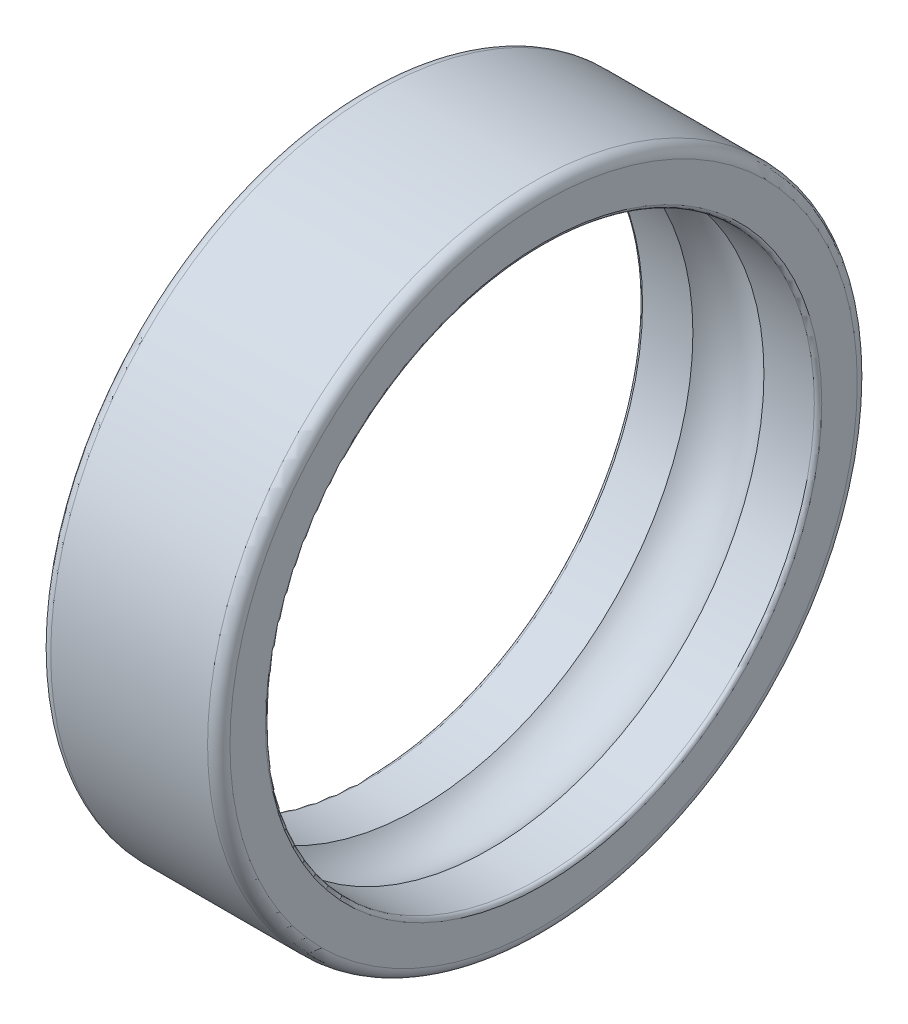
ISO-10303-21;
HEADER;
FILE_DESCRIPTION(('STEP AP214'),'2;1');
FILE_NAME('part.step','',(''),(''),'','','');
FILE_SCHEMA(('AUTOMOTIVE_DESIGN { 1 0 10303 214 1 1 1 1 }'));
ENDSEC;
DATA;
#1=APPLICATION_CONTEXT('core data for automotive mechanical design processes');
#2=APPLICATION_PROTOCOL_DEFINITION('international standard','automotive_design',2000,#1);
#3=PRODUCT_CONTEXT('',#1,'mechanical');
#4=PRODUCT('Part','Part','',(#3));
#5=PRODUCT_RELATED_PRODUCT_CATEGORY('part','',(#4));
#6=PRODUCT_DEFINITION_FORMATION('','',#4);
#7=PRODUCT_DEFINITION_CONTEXT('part definition',#1,'design');
#8=PRODUCT_DEFINITION('design','',#6,#7);
#9=PRODUCT_DEFINITION_SHAPE('','',#8);
#10=(LENGTH_UNIT() NAMED_UNIT(*) SI_UNIT(.MILLI.,.METRE.));
#11=(NAMED_UNIT(*) PLANE_ANGLE_UNIT() SI_UNIT($,.RADIAN.));
#12=(NAMED_UNIT(*) SI_UNIT($,.STERADIAN.) SOLID_ANGLE_UNIT());
#13=UNCERTAINTY_MEASURE_WITH_UNIT(LENGTH_MEASURE(1.E-05),#10,'distance_accuracy_value','');
#14=(GEOMETRIC_REPRESENTATION_CONTEXT(3) GLOBAL_UNCERTAINTY_ASSIGNED_CONTEXT((#13)) GLOBAL_UNIT_ASSIGNED_CONTEXT((#10,
#11,#12)) REPRESENTATION_CONTEXT('',''));
#15=CARTESIAN_POINT('',(0.,0.,0.));
#16=DIRECTION('',(0.,0.,1.));
#17=DIRECTION('',(1.,0.,0.));
#18=AXIS2_PLACEMENT_3D('',#15,#16,#17);
#19=CARTESIAN_POINT('',(0.,-28.520137624798,-28.));
#20=DIRECTION('',(-1.,0.,0.));
#21=DIRECTION('',(0.,0.,1.));
#22=AXIS2_PLACEMENT_3D('',#19,#20,#21);
#23=PLANE('',#22);
#24=CARTESIAN_POINT('',(0.,0.,0.));
#25=DIRECTION('',(-1.,0.,0.));
#26=DIRECTION('',(0.,0.,-1.));
#27=AXIS2_PLACEMENT_3D('',#24,#25,#26);
#28=CIRCLE('',#27,28.0000000447043);
#29=CARTESIAN_POINT('',(0.,0.,-28.0000000447043));
#30=VERTEX_POINT('',#29);
#31=EDGE_CURVE('E50',#30,#30,#28,.F.);
#32=ORIENTED_EDGE('',*,*,#31,.F.);
#33=EDGE_LOOP('',(#32));
#34=FACE_BOUND('',#33,.T.);
#35=CARTESIAN_POINT('',(0.,0.,0.));
#36=DIRECTION('',(1.,0.,0.));
#37=DIRECTION('',(0.,-1.16849134395206E-09,1.));
#38=AXIS2_PLACEMENT_3D('',#35,#36,#37);
#39=CIRCLE('',#38,24.8333333333337);
#40=CARTESIAN_POINT('',(0.,-2.90175350414764E-08,24.8333333333337));
#41=VERTEX_POINT('',#40);
#42=EDGE_CURVE('E47',#41,#41,#39,.T.);
#43=ORIENTED_EDGE('',*,*,#42,.T.);
#44=EDGE_LOOP('',(#43));
#45=FACE_BOUND('',#44,.T.);
#46=ADVANCED_FACE('F15',(#34,#45),#23,.T.);
#47=CARTESIAN_POINT('',(16.,-28.520137624798,28.));
#48=DIRECTION('',(1.,0.,0.));
#49=DIRECTION('',(0.,0.,-1.));
#50=AXIS2_PLACEMENT_3D('',#47,#48,#49);
#51=PLANE('',#50);
#52=CARTESIAN_POINT('',(16.,0.,0.));
#53=DIRECTION('',(1.,0.,0.));
#54=DIRECTION('',(0.,0.,1.));
#55=AXIS2_PLACEMENT_3D('',#52,#53,#54);
#56=CIRCLE('',#55,28.0000000965721);
#57=CARTESIAN_POINT('',(16.,0.,28.0000000965721));
#58=VERTEX_POINT('',#57);
#59=EDGE_CURVE('E44',#58,#58,#56,.T.);
#60=ORIENTED_EDGE('',*,*,#59,.T.);
#61=EDGE_LOOP('',(#60));
#62=FACE_BOUND('',#61,.T.);
#63=CARTESIAN_POINT('',(16.,0.,0.));
#64=DIRECTION('',(-1.,0.,0.));
#65=DIRECTION('',(0.,0.,-1.));
#66=AXIS2_PLACEMENT_3D('',#63,#64,#65);
#67=CIRCLE('',#66,24.8333334037541);
#68=CARTESIAN_POINT('',(16.,0.,-24.8333334037541));
#69=VERTEX_POINT('',#68);
#70=EDGE_CURVE('E41',#69,#69,#67,.F.);
#71=ORIENTED_EDGE('',*,*,#70,.F.);
#72=EDGE_LOOP('',(#71));
#73=FACE_BOUND('',#72,.T.);
#74=ADVANCED_FACE('F59',(#62,#73),#51,.T.);
#75=CARTESIAN_POINT('',(0.999999999999226,0.,0.));
#76=DIRECTION('',(1.,0.,0.));
#77=DIRECTION('',(0.,0.,1.));
#78=AXIS2_PLACEMENT_3D('',#75,#76,#77);
#79=TOROIDAL_SURFACE('',#78,28.0000000000008,0.999999999999227);
#80=ORIENTED_EDGE('',*,*,#31,.T.);
#81=EDGE_LOOP('',(#80));
#82=FACE_BOUND('',#81,.T.);
#83=CARTESIAN_POINT('',(0.999999999999226,0.,0.));
#84=DIRECTION('',(-1.,0.,0.));
#85=DIRECTION('',(0.,0.,-1.));
#86=AXIS2_PLACEMENT_3D('',#83,#84,#85);
#87=CIRCLE('',#86,29.);
#88=CARTESIAN_POINT('',(0.999999999999226,0.,-29.));
#89=VERTEX_POINT('',#88);
#90=EDGE_CURVE('E38',#89,#89,#87,.F.);
#91=ORIENTED_EDGE('',*,*,#90,.F.);
#92=EDGE_LOOP('',(#91));
#93=FACE_BOUND('',#92,.T.);
#94=ADVANCED_FACE('F54',(#82,#93),#79,.T.);
#95=CARTESIAN_POINT('',(0.333333333333645,0.,0.));
#96=DIRECTION('',(1.,0.,0.));
#97=DIRECTION('',(0.,0.,1.));
#98=AXIS2_PLACEMENT_3D('',#95,#96,#97);
#99=TOROIDAL_SURFACE('',#98,24.8333333333337,0.333333333333645);
#100=CARTESIAN_POINT('',(0.333333333333332,0.,0.));
#101=DIRECTION('',(1.,0.,0.));
#102=DIRECTION('',(0.,0.,1.));
#103=AXIS2_PLACEMENT_3D('',#100,#101,#102);
#104=CIRCLE('',#103,24.5);
#105=CARTESIAN_POINT('',(0.333333333333332,0.,24.5));
#106=VERTEX_POINT('',#105);
#107=EDGE_CURVE('E35',#106,#106,#104,.T.);
#108=ORIENTED_EDGE('',*,*,#107,.T.);
#109=EDGE_LOOP('',(#108));
#110=FACE_BOUND('',#109,.T.);
#111=ORIENTED_EDGE('',*,*,#42,.F.);
#112=EDGE_LOOP('',(#111));
#113=FACE_BOUND('',#112,.T.);
#114=ADVANCED_FACE('F63',(#110,#113),#99,.T.);
#115=CARTESIAN_POINT('',(50.,0.,0.));
#116=DIRECTION('',(1.,0.,0.));
#117=DIRECTION('',(0.,0.,1.));
#118=AXIS2_PLACEMENT_3D('',#115,#116,#117);
#119=CYLINDRICAL_SURFACE('',#118,24.5);
#120=CARTESIAN_POINT('',(4.8286295943236,0.,0.));
#121=DIRECTION('',(1.,0.,0.));
#122=DIRECTION('',(0.,0.,1.));
#123=AXIS2_PLACEMENT_3D('',#120,#121,#122);
#124=CIRCLE('',#123,24.5);
#125=CARTESIAN_POINT('',(4.8286295943236,0.,24.5));
#126=VERTEX_POINT('',#125);
#127=EDGE_CURVE('E30',#126,#126,#124,.T.);
#128=ORIENTED_EDGE('',*,*,#127,.T.);
#129=EDGE_LOOP('',(#128));
#130=FACE_BOUND('',#129,.T.);
#131=ORIENTED_EDGE('',*,*,#107,.F.);
#132=EDGE_LOOP('',(#131));
#133=FACE_BOUND('',#132,.T.);
#134=ADVANCED_FACE('F65',(#130,#133),#119,.F.);
#135=CARTESIAN_POINT('',(7.9999999999998,0.,0.));
#136=DIRECTION('',(1.,0.,0.));
#137=DIRECTION('',(0.,0.,1.));
#138=AXIS2_PLACEMENT_3D('',#135,#136,#137);
#139=TOROIDAL_SURFACE('',#138,21.5000000000004,4.36549999999956);
#140=ORIENTED_EDGE('',*,*,#127,.F.);
#141=EDGE_LOOP('',(#140));
#142=FACE_BOUND('',#141,.T.);
#143=CARTESIAN_POINT('',(11.171370405676,0.,0.));
#144=DIRECTION('',(1.,0.,0.));
#145=DIRECTION('',(0.,1.9234093241047E-10,1.));
#146=AXIS2_PLACEMENT_3D('',#143,#144,#145);
#147=CIRCLE('',#146,24.5);
#148=CARTESIAN_POINT('',(11.171370405676,4.71235284405652E-09,24.5));
#149=VERTEX_POINT('',#148);
#150=EDGE_CURVE('E26',#149,#149,#147,.T.);
#151=ORIENTED_EDGE('',*,*,#150,.T.);
#152=EDGE_LOOP('',(#151));
#153=FACE_BOUND('',#152,.T.);
#154=ADVANCED_FACE('F73',(#142,#153),#139,.F.);
#155=CARTESIAN_POINT('',(50.,0.,0.));
#156=DIRECTION('',(1.,0.,0.));
#157=DIRECTION('',(0.,7.69363362247841E-10,1.));
#158=AXIS2_PLACEMENT_3D('',#155,#156,#157);
#159=CYLINDRICAL_SURFACE('',#158,24.5);
#160=CARTESIAN_POINT('',(15.666666666667,0.,0.));
#161=DIRECTION('',(1.,0.,0.));
#162=DIRECTION('',(0.,0.,1.));
#163=AXIS2_PLACEMENT_3D('',#160,#161,#162);
#164=CIRCLE('',#163,24.5);
#165=CARTESIAN_POINT('',(15.666666666667,0.,24.5));
#166=VERTEX_POINT('',#165);
#167=EDGE_CURVE('E22',#166,#166,#164,.T.);
#168=ORIENTED_EDGE('',*,*,#167,.T.);
#169=EDGE_LOOP('',(#168));
#170=FACE_BOUND('',#169,.T.);
#171=ORIENTED_EDGE('',*,*,#150,.F.);
#172=EDGE_LOOP('',(#171));
#173=FACE_BOUND('',#172,.T.);
#174=ADVANCED_FACE('F81',(#170,#173),#159,.F.);
#175=CARTESIAN_POINT('',(15.6666666666661,0.,0.));
#176=DIRECTION('',(1.,0.,0.));
#177=DIRECTION('',(0.,7.69363362247841E-10,1.));
#178=AXIS2_PLACEMENT_3D('',#175,#176,#177);
#179=TOROIDAL_SURFACE('',#178,24.833333333334,0.333333333333956);
#180=ORIENTED_EDGE('',*,*,#70,.T.);
#181=EDGE_LOOP('',(#180));
#182=FACE_BOUND('',#181,.T.);
#183=ORIENTED_EDGE('',*,*,#167,.F.);
#184=EDGE_LOOP('',(#183));
#185=FACE_BOUND('',#184,.T.);
#186=ADVANCED_FACE('F85',(#182,#185),#179,.T.);
#187=CARTESIAN_POINT('',(15.0000000000016,0.,0.));
#188=DIRECTION('',(1.,0.,0.));
#189=DIRECTION('',(0.,0.,1.));
#190=AXIS2_PLACEMENT_3D('',#187,#188,#189);
#191=TOROIDAL_SURFACE('',#190,28.0000000000016,0.999999999998454);
#192=CARTESIAN_POINT('',(15.0000000000016,0.,0.));
#193=DIRECTION('',(1.,0.,0.));
#194=DIRECTION('',(0.,0.,1.));
#195=AXIS2_PLACEMENT_3D('',#192,#193,#194);
#196=CIRCLE('',#195,29.);
#197=CARTESIAN_POINT('',(15.0000000000016,0.,29.));
#198=VERTEX_POINT('',#197);
#199=EDGE_CURVE('E10',#198,#198,#196,.T.);
#200=ORIENTED_EDGE('',*,*,#199,.T.);
#201=EDGE_LOOP('',(#200));
#202=FACE_BOUND('',#201,.T.);
#203=ORIENTED_EDGE('',*,*,#59,.F.);
#204=EDGE_LOOP('',(#203));
#205=FACE_BOUND('',#204,.T.);
#206=ADVANCED_FACE('F87',(#202,#205),#191,.T.);
#207=CARTESIAN_POINT('',(50.,0.,0.));
#208=DIRECTION('',(1.,0.,0.));
#209=DIRECTION('',(0.,0.,1.));
#210=AXIS2_PLACEMENT_3D('',#207,#208,#209);
#211=CYLINDRICAL_SURFACE('',#210,29.);
#212=ORIENTED_EDGE('',*,*,#90,.T.);
#213=EDGE_LOOP('',(#212));
#214=FACE_BOUND('',#213,.T.);
#215=ORIENTED_EDGE('',*,*,#199,.F.);
#216=EDGE_LOOP('',(#215));
#217=FACE_BOUND('',#216,.T.);
#218=ADVANCED_FACE('F17',(#214,#217),#211,.T.);
#219=CLOSED_SHELL('',(#46,#74,#94,#114,#134,#154,#174,#186,#206,#218));
#220=MANIFOLD_SOLID_BREP('B1',#219);
#221=ADVANCED_BREP_SHAPE_REPRESENTATION('',(#18,#220),#14);
#222=SHAPE_DEFINITION_REPRESENTATION(#9,#221);
ENDSEC;
END-ISO-10303-21;
